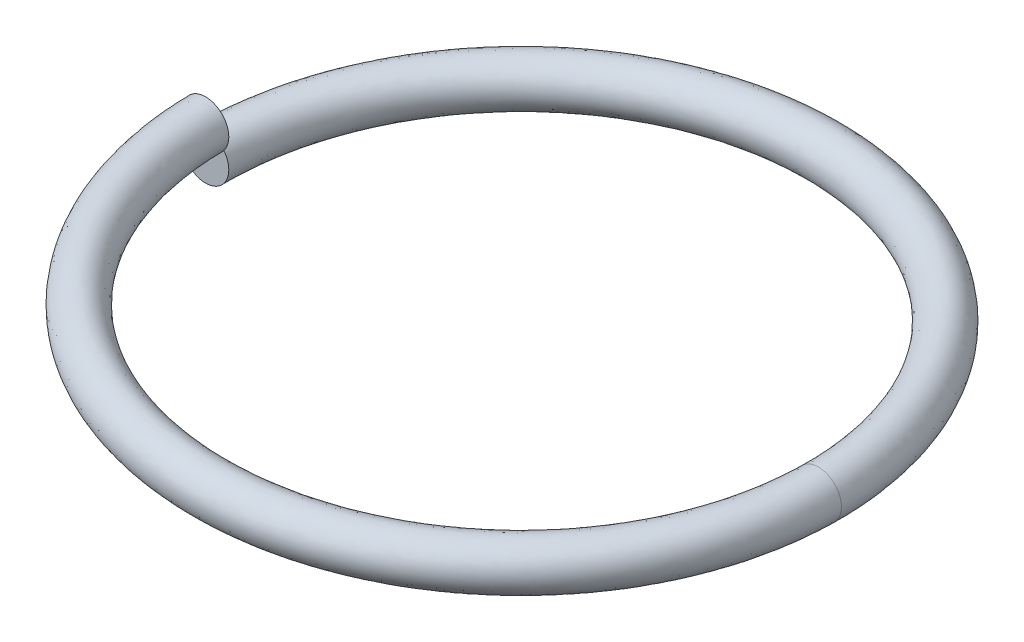
ISO-10303-21;
HEADER;
FILE_DESCRIPTION(('STEP AP214'),'2;1');
FILE_NAME('part.step','',(''),(''),'','','');
FILE_SCHEMA(('AUTOMOTIVE_DESIGN { 1 0 10303 214 1 1 1 1 }'));
ENDSEC;
DATA;
#1=APPLICATION_CONTEXT('core data for automotive mechanical design processes');
#2=APPLICATION_PROTOCOL_DEFINITION('international standard','automotive_design',2000,#1);
#3=PRODUCT_CONTEXT('',#1,'mechanical');
#4=PRODUCT('Part','Part','',(#3));
#5=PRODUCT_RELATED_PRODUCT_CATEGORY('part','',(#4));
#6=PRODUCT_DEFINITION_FORMATION('','',#4);
#7=PRODUCT_DEFINITION_CONTEXT('part definition',#1,'design');
#8=PRODUCT_DEFINITION('design','',#6,#7);
#9=PRODUCT_DEFINITION_SHAPE('','',#8);
#10=(LENGTH_UNIT() NAMED_UNIT(*) SI_UNIT(.MILLI.,.METRE.));
#11=(NAMED_UNIT(*) PLANE_ANGLE_UNIT() SI_UNIT($,.RADIAN.));
#12=(NAMED_UNIT(*) SI_UNIT($,.STERADIAN.) SOLID_ANGLE_UNIT());
#13=UNCERTAINTY_MEASURE_WITH_UNIT(LENGTH_MEASURE(1.E-05),#10,'distance_accuracy_value','');
#14=(GEOMETRIC_REPRESENTATION_CONTEXT(3) GLOBAL_UNCERTAINTY_ASSIGNED_CONTEXT((#13)) GLOBAL_UNIT_ASSIGNED_CONTEXT((#10,
#11,#12)) REPRESENTATION_CONTEXT('',''));
#15=CARTESIAN_POINT('',(0.,0.,0.));
#16=DIRECTION('',(0.,0.,1.));
#17=DIRECTION('',(1.,0.,0.));
#18=AXIS2_PLACEMENT_3D('',#15,#16,#17);
#19=CARTESIAN_POINT('',(7.95,0.4,0.));
#20=CARTESIAN_POINT('',(7.95000000000001,0.416666666666639,1.04065256451533));
#21=CARTESIAN_POINT('',(7.74308277875318,0.433333333333327,2.08089568249132));
#22=CARTESIAN_POINT('',(6.94660178817624,0.466666666666673,4.0037708921137));
#23=CARTESIAN_POINT('',(6.3573513956609,0.483333333333294,4.88564642520467));
#24=CARTESIAN_POINT('',(4.88564642520511,0.516666666666706,6.35735139566153));
#25=CARTESIAN_POINT('',(4.00377089210932,0.533333333333294,6.94660178817789));
#26=CARTESIAN_POINT('',(2.08089568249546,0.566666666666706,7.74308277875163));
#27=CARTESIAN_POINT('',(1.04065256451522,0.58333333333336,7.95));
#28=CARTESIAN_POINT('',(-1.04065256451539,0.61666666666664,7.95));
#29=CARTESIAN_POINT('',(-2.08089568249508,0.63333333333336,7.74308277875104));
#30=CARTESIAN_POINT('',(-4.00377089211001,0.66666666666664,6.94660178817835));
#31=CARTESIAN_POINT('',(-4.88564642520575,0.68333333333336,6.35735139566088));
#32=CARTESIAN_POINT('',(-6.35735139566049,0.71666666666664,4.88564642520509));
#33=CARTESIAN_POINT('',(-6.9466017881779,0.733333333333294,4.0037708921093));
#34=CARTESIAN_POINT('',(-7.74308277875165,0.766666666666706,2.08089568249543));
#35=CARTESIAN_POINT('',(-7.95,0.783333333333228,1.04065257047754));
#36=CARTESIAN_POINT('',(-7.95,0.8,-1.11029106575212E-13));
#37=CARTESIAN_POINT('',(7.95,1.7,0.));
#38=CARTESIAN_POINT('',(7.95000000000001,1.71666666666667,1.04065256451532));
#39=CARTESIAN_POINT('',(7.74308277875318,1.73333333333329,2.08089568249131));
#40=CARTESIAN_POINT('',(6.94660178817624,1.7666666666667,4.0037708921137));
#41=CARTESIAN_POINT('',(6.3573513956609,1.78333333333329,4.88564642520467));
#42=CARTESIAN_POINT('',(4.88564642520511,1.8166666666667,6.35735139566153));
#43=CARTESIAN_POINT('',(4.00377089210932,1.83333333333329,6.94660178817789));
#44=CARTESIAN_POINT('',(2.08089568249546,1.8666666666667,7.74308277875163));
#45=CARTESIAN_POINT('',(1.04065256451522,1.88333333333332,7.95));
#46=CARTESIAN_POINT('',(-1.04065256451539,1.91666666666667,7.95));
#47=CARTESIAN_POINT('',(-2.08089568249508,1.93333333333339,7.74308277875104));
#48=CARTESIAN_POINT('',(-4.00377089211001,1.9666666666666,6.94660178817835));
#49=CARTESIAN_POINT('',(-4.88564642520575,1.98333333333332,6.35735139566088));
#50=CARTESIAN_POINT('',(-6.35735139566049,2.01666666666667,4.88564642520509));
#51=CARTESIAN_POINT('',(-6.9466017881779,2.03333333333329,4.0037708921093));
#52=CARTESIAN_POINT('',(-7.74308277875165,2.0666666666667,2.08089568249543));
#53=CARTESIAN_POINT('',(-7.95,2.08333333333339,1.04065257047754));
#54=CARTESIAN_POINT('',(-7.95,2.1,-1.11029106575212E-13));
#55=CARTESIAN_POINT('',(9.25,1.7,0.));
#56=CARTESIAN_POINT('',(9.25000000000001,1.71666666666667,1.21082216625997));
#57=CARTESIAN_POINT('',(9.00924725829716,1.73333333333329,2.42116793245872));
#58=CARTESIAN_POINT('',(8.08252409316161,1.7666666666667,4.65847556629554));
#59=CARTESIAN_POINT('',(7.39691829054858,1.78333333333329,5.68455716140149));
#60=CARTESIAN_POINT('',(5.68455716140243,1.8166666666667,7.39691829054976));
#61=CARTESIAN_POINT('',(4.65847556629087,1.83333333333329,8.08252409316273));
#62=CARTESIAN_POINT('',(2.42116793246311,1.8666666666667,9.00924725829615));
#63=CARTESIAN_POINT('',(1.21082216625985,1.88333333333332,9.25));
#64=CARTESIAN_POINT('',(-1.21082216626004,1.91666666666667,9.25));
#65=CARTESIAN_POINT('',(-2.42116793246303,1.93333333333339,9.00924725829501));
#66=CARTESIAN_POINT('',(-4.65847556629132,1.9666666666666,8.08252409316372));
#67=CARTESIAN_POINT('',(-5.68455716140257,1.98333333333332,7.39691829054856));
#68=CARTESIAN_POINT('',(-7.39691829054872,2.01666666666667,5.68455716140241));
#69=CARTESIAN_POINT('',(-8.08252409316274,2.03333333333329,4.65847556629058));
#70=CARTESIAN_POINT('',(-9.00924725829616,2.0666666666667,2.42116793246335));
#71=CARTESIAN_POINT('',(-9.25000000000106,2.08333333333339,1.21082217319713));
#72=CARTESIAN_POINT('',(-9.25,2.1,-1.29184809537196E-13));
#73=CARTESIAN_POINT('',(9.25,0.4,0.));
#74=CARTESIAN_POINT('',(9.25000000000001,0.416666666666639,1.21082216625997));
#75=CARTESIAN_POINT('',(9.00924725829716,0.433333333333327,2.42116793245872));
#76=CARTESIAN_POINT('',(8.08252409316161,0.466666666666673,4.65847556629554));
#77=CARTESIAN_POINT('',(7.39691829054858,0.483333333333294,5.68455716140149));
#78=CARTESIAN_POINT('',(5.68455716140243,0.516666666666706,7.39691829054976));
#79=CARTESIAN_POINT('',(4.65847556629087,0.533333333333294,8.08252409316273));
#80=CARTESIAN_POINT('',(2.42116793246311,0.566666666666706,9.00924725829615));
#81=CARTESIAN_POINT('',(1.21082216625985,0.58333333333336,9.25));
#82=CARTESIAN_POINT('',(-1.21082216626004,0.61666666666664,9.25));
#83=CARTESIAN_POINT('',(-2.42116793246303,0.63333333333336,9.00924725829501));
#84=CARTESIAN_POINT('',(-4.65847556629132,0.66666666666664,8.08252409316372));
#85=CARTESIAN_POINT('',(-5.68455716140257,0.68333333333336,7.39691829054856));
#86=CARTESIAN_POINT('',(-7.39691829054872,0.71666666666664,5.68455716140241));
#87=CARTESIAN_POINT('',(-8.08252409316274,0.733333333333294,4.65847556629058));
#88=CARTESIAN_POINT('',(-9.00924725829616,0.766666666666706,2.42116793246335));
#89=CARTESIAN_POINT('',(-9.25000000000106,0.783333333333228,1.21082217319713));
#90=CARTESIAN_POINT('',(-9.25,0.8,-1.29184809537196E-13));
#91=CARTESIAN_POINT('',(9.25,-0.899999999999998,0.));
#92=CARTESIAN_POINT('',(9.25000000000001,-0.883333333333392,1.21082216625997));
#93=CARTESIAN_POINT('',(9.00924725829716,-0.866666666666638,2.42116793245872));
#94=CARTESIAN_POINT('',(8.08252409316161,-0.833333333333358,4.65847556629554));
#95=CARTESIAN_POINT('',(7.39691829054858,-0.816666666666704,5.68455716140149));
#96=CARTESIAN_POINT('',(5.68455716140243,-0.783333333333292,7.39691829054976));
#97=CARTESIAN_POINT('',(4.65847556629087,-0.766666666666704,8.08252409316273));
#98=CARTESIAN_POINT('',(2.42116793246311,-0.733333333333292,9.00924725829615));
#99=CARTESIAN_POINT('',(1.21082216625985,-0.716666666666604,9.25));
#100=CARTESIAN_POINT('',(-1.21082216626004,-0.683333333333391,9.25));
#101=CARTESIAN_POINT('',(-2.42116793246303,-0.666666666666671,9.00924725829501));
#102=CARTESIAN_POINT('',(-4.65847556629132,-0.633333333333325,8.08252409316372));
#103=CARTESIAN_POINT('',(-5.68455716140257,-0.616666666666605,7.39691829054856));
#104=CARTESIAN_POINT('',(-7.39691829054872,-0.583333333333391,5.68455716140241));
#105=CARTESIAN_POINT('',(-8.08252409316274,-0.566666666666704,4.65847556629058));
#106=CARTESIAN_POINT('',(-9.00924725829616,-0.533333333333292,2.42116793246335));
#107=CARTESIAN_POINT('',(-9.25000000000106,-0.516666666666936,1.21082217319713));
#108=CARTESIAN_POINT('',(-9.25,-0.499999999999998,-1.29184809537196E-13));
#109=CARTESIAN_POINT('',(7.95,-0.899999999999998,0.));
#110=CARTESIAN_POINT('',(7.95000000000001,-0.883333333333392,1.04065256451532));
#111=CARTESIAN_POINT('',(7.74308277875318,-0.866666666666638,2.08089568249131));
#112=CARTESIAN_POINT('',(6.94660178817624,-0.833333333333358,4.0037708921137));
#113=CARTESIAN_POINT('',(6.3573513956609,-0.816666666666704,4.88564642520467));
#114=CARTESIAN_POINT('',(4.88564642520511,-0.783333333333292,6.35735139566153));
#115=CARTESIAN_POINT('',(4.00377089210932,-0.766666666666704,6.94660178817789));
#116=CARTESIAN_POINT('',(2.08089568249546,-0.733333333333292,7.74308277875163));
#117=CARTESIAN_POINT('',(1.04065256451522,-0.716666666666604,7.95));
#118=CARTESIAN_POINT('',(-1.04065256451538,-0.683333333333391,7.95));
#119=CARTESIAN_POINT('',(-2.08089568249508,-0.666666666666671,7.74308277875104));
#120=CARTESIAN_POINT('',(-4.00377089211001,-0.633333333333325,6.94660178817835));
#121=CARTESIAN_POINT('',(-4.88564642520575,-0.616666666666605,6.35735139566088));
#122=CARTESIAN_POINT('',(-6.35735139566049,-0.583333333333391,4.88564642520509));
#123=CARTESIAN_POINT('',(-6.9466017881779,-0.566666666666704,4.0037708921093));
#124=CARTESIAN_POINT('',(-7.74308277875165,-0.533333333333292,2.08089568249543));
#125=CARTESIAN_POINT('',(-7.95,-0.516666666666936,1.04065257047754));
#126=CARTESIAN_POINT('',(-7.95,-0.499999999999998,-1.11029106575212E-13));
#127=CARTESIAN_POINT('',(7.95,0.4,0.));
#128=CARTESIAN_POINT('',(7.95000000000001,0.416666666666639,1.04065256451533));
#129=CARTESIAN_POINT('',(7.74308277875318,0.433333333333327,2.08089568249132));
#130=CARTESIAN_POINT('',(6.94660178817624,0.466666666666673,4.0037708921137));
#131=CARTESIAN_POINT('',(6.3573513956609,0.483333333333294,4.88564642520467));
#132=CARTESIAN_POINT('',(4.88564642520511,0.516666666666706,6.35735139566153));
#133=CARTESIAN_POINT('',(4.00377089210932,0.533333333333294,6.94660178817789));
#134=CARTESIAN_POINT('',(2.08089568249546,0.566666666666706,7.74308277875163));
#135=CARTESIAN_POINT('',(1.04065256451522,0.58333333333336,7.95));
#136=CARTESIAN_POINT('',(-1.04065256451539,0.61666666666664,7.95));
#137=CARTESIAN_POINT('',(-2.08089568249508,0.63333333333336,7.74308277875104));
#138=CARTESIAN_POINT('',(-4.00377089211001,0.66666666666664,6.94660178817835));
#139=CARTESIAN_POINT('',(-4.88564642520575,0.68333333333336,6.35735139566088));
#140=CARTESIAN_POINT('',(-6.35735139566049,0.71666666666664,4.88564642520509));
#141=CARTESIAN_POINT('',(-6.9466017881779,0.733333333333294,4.0037708921093));
#142=CARTESIAN_POINT('',(-7.74308277875165,0.766666666666706,2.08089568249543));
#143=CARTESIAN_POINT('',(-7.95,0.783333333333228,1.04065257047754));
#144=CARTESIAN_POINT('',(-7.95,0.8,-1.11029106575212E-13));
#145=(BOUNDED_SURFACE() B_SPLINE_SURFACE(3,3,((#19,#20,#21,#22,#23,#24,#25,#26,#27,#28,#29,#30,
#31,#32,#33,#34,#35,#36),(#37,#38,#39,#40,#41,#42,#43,#44,#45,#46,#47,#48,#49,#50,#51,#52,#53,
#54),(#55,#56,#57,#58,#59,#60,#61,#62,#63,#64,#65,#66,#67,#68,#69,#70,#71,#72),(#73,#74,#75,#76,
#77,#78,#79,#80,#81,#82,#83,#84,#85,#86,#87,#88,#89,#90),(#91,#92,#93,#94,#95,#96,#97,#98,#99,
#100,#101,#102,#103,#104,#105,#106,#107,#108),(#109,#110,#111,#112,#113,#114,#115,#116,#117,
#118,#119,#120,#121,#122,#123,#124,#125,#126),(#127,#128,#129,#130,#131,#132,#133,#134,#135,
#136,#137,#138,#139,#140,#141,#142,#143,#144)),.UNSPECIFIED.,.T.,.F.,
.F.) B_SPLINE_SURFACE_WITH_KNOTS((4,3,4),(4,2,2,2,2,2,2,2,4),(0.,0.5,1.),(0.5,0.5625,0.625,
0.6875,0.75,0.8125,0.875,0.9375,1.),
.UNSPECIFIED.) GEOMETRIC_REPRESENTATION_ITEM() RATIONAL_B_SPLINE_SURFACE(((1.,1.,1.,1.,1.,1.,1.,
1.,1.,1.,1.,1.,1.,1.,1.,1.,1.,1.),(0.333333333333333,0.333333333333333,0.333333333333333,
0.333333333333333,0.333333333333333,0.333333333333333,0.333333333333333,0.333333333333333,
0.333333333333333,0.333333333333333,0.333333333333333,0.333333333333333,0.333333333333333,
0.333333333333333,0.333333333333333,0.333333333333333,0.333333333333333,0.333333333333333),
(0.333333333333333,0.333333333333333,0.333333333333333,0.333333333333333,0.333333333333333,
0.333333333333333,0.333333333333333,0.333333333333333,0.333333333333333,0.333333333333333,
0.333333333333333,0.333333333333333,0.333333333333333,0.333333333333333,0.333333333333333,
0.333333333333333,0.333333333333333,0.333333333333333),(1.,1.,1.,1.,1.,1.,1.,1.,1.,1.,1.,1.,1.,
1.,1.,1.,1.,1.),(0.333333333333333,0.333333333333333,0.333333333333333,0.333333333333333,
0.333333333333333,0.333333333333333,0.333333333333333,0.333333333333333,0.333333333333333,
0.333333333333333,0.333333333333333,0.333333333333333,0.333333333333333,0.333333333333333,
0.333333333333333,0.333333333333333,0.333333333333333,0.333333333333333),(0.333333333333333,
0.333333333333333,0.333333333333333,0.333333333333333,0.333333333333333,0.333333333333333,
0.333333333333333,0.333333333333333,0.333333333333333,0.333333333333333,0.333333333333333,
0.333333333333333,0.333333333333333,0.333333333333333,0.333333333333333,0.333333333333333,
0.333333333333333,0.333333333333333),(1.,1.,1.,1.,1.,1.,1.,1.,1.,1.,1.,1.,1.,1.,1.,1.,1.,1.))) REPRESENTATION_ITEM('') SURFACE());
#146=CARTESIAN_POINT('',(-8.6,0.8,-1.20106958056204E-13));
#147=DIRECTION('',(0.,0.,1.));
#148=DIRECTION('',(1.,0.,0.));
#149=AXIS2_PLACEMENT_3D('',#146,#147,#148);
#150=CIRCLE('',#149,0.649999999999999);
#151=CARTESIAN_POINT('',(-7.95,0.8,-1.11029106575212E-13));
#152=VERTEX_POINT('',#151);
#153=EDGE_CURVE('E48',#152,#152,#150,.T.);
#154=CARTESIAN_POINT('',(8.6,0.399999999999998,0.));
#155=DIRECTION('',(0.,0.,-1.));
#156=DIRECTION('',(-1.,0.,0.));
#157=AXIS2_PLACEMENT_3D('',#154,#155,#156);
#158=CIRCLE('',#157,0.65);
#159=CARTESIAN_POINT('',(7.95,0.399999999999998,0.));
#160=VERTEX_POINT('',#159);
#161=EDGE_CURVE('E11',#160,#160,#158,.T.);
#162=ORIENTED_EDGE('',*,*,#153,.T.);
#163=EDGE_LOOP('',(#162));
#164=FACE_BOUND('',#163,.T.);
#165=ORIENTED_EDGE('',*,*,#161,.F.);
#166=EDGE_LOOP('',(#165));
#167=FACE_BOUND('',#166,.T.);
#168=ADVANCED_FACE('F39',(#164,#167),#145,.F.);
#169=CARTESIAN_POINT('',(-8.6,0.,0.));
#170=DIRECTION('',(0.,0.,1.));
#171=DIRECTION('',(1.,0.,0.));
#172=AXIS2_PLACEMENT_3D('',#169,#170,#171);
#173=PLANE('',#172);
#174=CARTESIAN_POINT('',(-8.6,0.,0.));
#175=DIRECTION('',(0.,0.,1.));
#176=DIRECTION('',(1.,0.,0.));
#177=AXIS2_PLACEMENT_3D('',#174,#175,#176);
#178=CIRCLE('',#177,0.649999999999999);
#179=CARTESIAN_POINT('',(-7.95,0.,0.));
#180=VERTEX_POINT('',#179);
#181=EDGE_CURVE('E53',#180,#180,#178,.T.);
#182=ORIENTED_EDGE('',*,*,#181,.T.);
#183=EDGE_LOOP('',(#182));
#184=FACE_BOUND('',#183,.T.);
#185=ADVANCED_FACE('F61',(#184),#173,.T.);
#186=CARTESIAN_POINT('',(-8.6,0.8,-1.20106958056204E-13));
#187=DIRECTION('',(0.,0.,1.));
#188=DIRECTION('',(1.,0.,0.));
#189=AXIS2_PLACEMENT_3D('',#186,#187,#188);
#190=PLANE('',#189);
#191=ORIENTED_EDGE('',*,*,#153,.F.);
#192=EDGE_LOOP('',(#191));
#193=FACE_BOUND('',#192,.T.);
#194=ADVANCED_FACE('F63',(#193),#190,.F.);
#195=CARTESIAN_POINT('',(-7.95,0.,0.));
#196=CARTESIAN_POINT('',(-7.95,0.0166666666666667,-1.04065257047652));
#197=CARTESIAN_POINT('',(-7.74308277875246,0.03333333333333,-2.08089568249237));
#198=CARTESIAN_POINT('',(-6.946601788177,0.06666666666667,-4.00377089211257));
#199=CARTESIAN_POINT('',(-6.35735139566025,0.0833333333333315,-4.88564642520639));
#200=CARTESIAN_POINT('',(-4.88564642520584,0.116666666666668,-6.35735139565974));
#201=CARTESIAN_POINT('',(-4.00377089211307,0.133333333333333,-6.94660178817669));
#202=CARTESIAN_POINT('',(-2.08089568249182,0.166666666666667,-7.74308277875279));
#203=CARTESIAN_POINT('',(-1.04065256451396,0.18333333333333,-7.95));
#204=CARTESIAN_POINT('',(1.04065256451402,0.21666666666667,-7.95));
#205=CARTESIAN_POINT('',(2.08089568249344,0.23333333333336,-7.74308277875212));
#206=CARTESIAN_POINT('',(4.00377089211155,0.26666666666664,-6.94660178817731));
#207=CARTESIAN_POINT('',(4.88564642520519,0.283333333333327,-6.35735139566092));
#208=CARTESIAN_POINT('',(6.35735139566098,0.316666666666673,-4.88564642520512));
#209=CARTESIAN_POINT('',(6.94660178817628,0.333333333333327,-4.00377089211386));
#210=CARTESIAN_POINT('',(7.7430827787532,0.366666666666672,-2.08089568249101));
#211=CARTESIAN_POINT('',(7.94999999999999,0.38333333333336,-1.04065256451528));
#212=CARTESIAN_POINT('',(7.95,0.4,0.));
#213=CARTESIAN_POINT('',(-7.95,1.3,0.));
#214=CARTESIAN_POINT('',(-7.95,1.31666666666666,-1.04065257047652));
#215=CARTESIAN_POINT('',(-7.74308277875246,1.33333333333333,-2.08089568249237));
#216=CARTESIAN_POINT('',(-6.946601788177,1.36666666666667,-4.00377089211257));
#217=CARTESIAN_POINT('',(-6.35735139566025,1.38333333333333,-4.88564642520639));
#218=CARTESIAN_POINT('',(-4.88564642520584,1.41666666666667,-6.35735139565974));
#219=CARTESIAN_POINT('',(-4.00377089211307,1.43333333333333,-6.94660178817669));
#220=CARTESIAN_POINT('',(-2.08089568249182,1.46666666666666,-7.74308277875279));
#221=CARTESIAN_POINT('',(-1.04065256451396,1.48333333333333,-7.95));
#222=CARTESIAN_POINT('',(1.04065256451402,1.51666666666667,-7.95));
#223=CARTESIAN_POINT('',(2.08089568249344,1.53333333333349,-7.74308277875212));
#224=CARTESIAN_POINT('',(4.00377089211155,1.56666666666651,-6.94660178817731));
#225=CARTESIAN_POINT('',(4.88564642520519,1.58333333333332,-6.35735139566092));
#226=CARTESIAN_POINT('',(6.35735139566098,1.61666666666667,-4.88564642520512));
#227=CARTESIAN_POINT('',(6.94660178817628,1.63333333333332,-4.00377089211386));
#228=CARTESIAN_POINT('',(7.7430827787532,1.66666666666667,-2.08089568249101));
#229=CARTESIAN_POINT('',(7.94999999999999,1.68333333333332,-1.04065256451528));
#230=CARTESIAN_POINT('',(7.95,1.7,0.));
#231=CARTESIAN_POINT('',(-9.25,1.3,0.));
#232=CARTESIAN_POINT('',(-9.25000000000106,1.31666666666666,-1.21082217319595));
#233=CARTESIAN_POINT('',(-9.00924725829755,1.33333333333333,-2.42116793245991));
#234=CARTESIAN_POINT('',(-8.08252409316125,1.36666666666667,-4.65847556629427));
#235=CARTESIAN_POINT('',(-7.39691829054755,1.38333333333333,-5.68455716140358));
#236=CARTESIAN_POINT('',(-5.68455716140356,1.41666666666667,-7.39691829054757));
#237=CARTESIAN_POINT('',(-4.65847556629515,1.43333333333333,-8.08252409316089));
#238=CARTESIAN_POINT('',(-2.42116793245897,1.46666666666666,-9.00924725829794));
#239=CARTESIAN_POINT('',(-1.21082216625838,1.48333333333333,-9.25));
#240=CARTESIAN_POINT('',(1.21082216625845,1.51666666666667,-9.25));
#241=CARTESIAN_POINT('',(2.42116793246138,1.53333333333349,-9.0092472582961));
#242=CARTESIAN_POINT('',(4.65847556629285,1.56666666666651,-8.08252409316268));
#243=CARTESIAN_POINT('',(5.68455716140252,1.58333333333332,-7.39691829054913));
#244=CARTESIAN_POINT('',(7.39691829054867,1.61666666666667,-5.68455716140193));
#245=CARTESIAN_POINT('',(8.08252409316165,1.63333333333332,-4.65847556629568));
#246=CARTESIAN_POINT('',(9.00924725829718,1.66666666666667,-2.42116793245841));
#247=CARTESIAN_POINT('',(9.24999999999999,1.68333333333332,-1.21082216625992));
#248=CARTESIAN_POINT('',(9.25,1.7,0.));
#249=CARTESIAN_POINT('',(-9.25,0.,0.));
#250=CARTESIAN_POINT('',(-9.25000000000106,0.0166666666666667,-1.21082217319595));
#251=CARTESIAN_POINT('',(-9.00924725829755,0.0333333333333301,-2.42116793245991));
#252=CARTESIAN_POINT('',(-8.08252409316125,0.0666666666666701,-4.65847556629427));
#253=CARTESIAN_POINT('',(-7.39691829054755,0.0833333333333316,-5.68455716140358));
#254=CARTESIAN_POINT('',(-5.68455716140356,0.116666666666669,-7.39691829054757));
#255=CARTESIAN_POINT('',(-4.65847556629515,0.133333333333333,-8.08252409316089));
#256=CARTESIAN_POINT('',(-2.42116793245897,0.166666666666667,-9.00924725829794));
#257=CARTESIAN_POINT('',(-1.21082216625838,0.18333333333333,-9.25));
#258=CARTESIAN_POINT('',(1.21082216625845,0.21666666666667,-9.25));
#259=CARTESIAN_POINT('',(2.42116793246138,0.23333333333336,-9.0092472582961));
#260=CARTESIAN_POINT('',(4.65847556629285,0.26666666666664,-8.08252409316268));
#261=CARTESIAN_POINT('',(5.68455716140252,0.283333333333327,-7.39691829054913));
#262=CARTESIAN_POINT('',(7.39691829054867,0.316666666666673,-5.68455716140193));
#263=CARTESIAN_POINT('',(8.08252409316165,0.333333333333327,-4.65847556629568));
#264=CARTESIAN_POINT('',(9.00924725829718,0.366666666666673,-2.42116793245841));
#265=CARTESIAN_POINT('',(9.24999999999999,0.38333333333336,-1.21082216625992));
#266=CARTESIAN_POINT('',(9.25,0.4,0.));
#267=CARTESIAN_POINT('',(-9.25,-1.3,0.));
#268=CARTESIAN_POINT('',(-9.25000000000106,-1.28333333333333,-1.21082217319595));
#269=CARTESIAN_POINT('',(-9.00924725829755,-1.26666666666667,-2.42116793245991));
#270=CARTESIAN_POINT('',(-8.08252409316125,-1.23333333333333,-4.65847556629427));
#271=CARTESIAN_POINT('',(-7.39691829054755,-1.21666666666667,-5.68455716140358));
#272=CARTESIAN_POINT('',(-5.68455716140356,-1.18333333333333,-7.39691829054757));
#273=CARTESIAN_POINT('',(-4.65847556629515,-1.16666666666666,-8.08252409316089));
#274=CARTESIAN_POINT('',(-2.42116793245897,-1.13333333333333,-9.00924725829794));
#275=CARTESIAN_POINT('',(-1.21082216625838,-1.11666666666667,-9.25));
#276=CARTESIAN_POINT('',(1.21082216625845,-1.08333333333333,-9.25));
#277=CARTESIAN_POINT('',(2.42116793246138,-1.06666666666677,-9.0092472582961));
#278=CARTESIAN_POINT('',(4.65847556629285,-1.03333333333323,-8.08252409316268));
#279=CARTESIAN_POINT('',(5.68455716140252,-1.01666666666667,-7.39691829054913));
#280=CARTESIAN_POINT('',(7.39691829054867,-0.983333333333325,-5.68455716140193));
#281=CARTESIAN_POINT('',(8.08252409316165,-0.966666666666671,-4.65847556629568));
#282=CARTESIAN_POINT('',(9.00924725829718,-0.933333333333325,-2.42116793245841));
#283=CARTESIAN_POINT('',(9.24999999999999,-0.916666666666605,-1.21082216625992));
#284=CARTESIAN_POINT('',(9.25,-0.899999999999998,0.));
#285=CARTESIAN_POINT('',(-7.95,-1.3,0.));
#286=CARTESIAN_POINT('',(-7.95,-1.28333333333333,-1.04065257047652));
#287=CARTESIAN_POINT('',(-7.74308277875246,-1.26666666666667,-2.08089568249237));
#288=CARTESIAN_POINT('',(-6.946601788177,-1.23333333333333,-4.00377089211257));
#289=CARTESIAN_POINT('',(-6.35735139566025,-1.21666666666667,-4.88564642520639));
#290=CARTESIAN_POINT('',(-4.88564642520584,-1.18333333333333,-6.35735139565974));
#291=CARTESIAN_POINT('',(-4.00377089211307,-1.16666666666666,-6.94660178817669));
#292=CARTESIAN_POINT('',(-2.08089568249182,-1.13333333333333,-7.74308277875279));
#293=CARTESIAN_POINT('',(-1.04065256451396,-1.11666666666667,-7.95));
#294=CARTESIAN_POINT('',(1.04065256451402,-1.08333333333333,-7.95));
#295=CARTESIAN_POINT('',(2.08089568249344,-1.06666666666677,-7.74308277875212));
#296=CARTESIAN_POINT('',(4.00377089211155,-1.03333333333323,-6.94660178817731));
#297=CARTESIAN_POINT('',(4.88564642520519,-1.01666666666667,-6.35735139566092));
#298=CARTESIAN_POINT('',(6.35735139566098,-0.983333333333325,-4.88564642520512));
#299=CARTESIAN_POINT('',(6.94660178817628,-0.966666666666671,-4.00377089211386));
#300=CARTESIAN_POINT('',(7.7430827787532,-0.933333333333325,-2.08089568249101));
#301=CARTESIAN_POINT('',(7.94999999999999,-0.916666666666605,-1.04065256451528));
#302=CARTESIAN_POINT('',(7.95,-0.899999999999998,0.));
#303=CARTESIAN_POINT('',(-7.95,0.,0.));
#304=CARTESIAN_POINT('',(-7.95,0.0166666666666667,-1.04065257047652));
#305=CARTESIAN_POINT('',(-7.74308277875246,0.03333333333333,-2.08089568249237));
#306=CARTESIAN_POINT('',(-6.946601788177,0.06666666666667,-4.00377089211257));
#307=CARTESIAN_POINT('',(-6.35735139566025,0.0833333333333315,-4.88564642520639));
#308=CARTESIAN_POINT('',(-4.88564642520584,0.116666666666668,-6.35735139565974));
#309=CARTESIAN_POINT('',(-4.00377089211307,0.133333333333333,-6.94660178817669));
#310=CARTESIAN_POINT('',(-2.08089568249182,0.166666666666667,-7.74308277875279));
#311=CARTESIAN_POINT('',(-1.04065256451396,0.18333333333333,-7.95));
#312=CARTESIAN_POINT('',(1.04065256451402,0.21666666666667,-7.95));
#313=CARTESIAN_POINT('',(2.08089568249344,0.23333333333336,-7.74308277875212));
#314=CARTESIAN_POINT('',(4.00377089211155,0.26666666666664,-6.94660178817731));
#315=CARTESIAN_POINT('',(4.88564642520519,0.283333333333327,-6.35735139566092));
#316=CARTESIAN_POINT('',(6.35735139566098,0.316666666666673,-4.88564642520512));
#317=CARTESIAN_POINT('',(6.94660178817628,0.333333333333327,-4.00377089211386));
#318=CARTESIAN_POINT('',(7.7430827787532,0.366666666666672,-2.08089568249101));
#319=CARTESIAN_POINT('',(7.94999999999999,0.38333333333336,-1.04065256451528));
#320=CARTESIAN_POINT('',(7.95,0.4,0.));
#321=(BOUNDED_SURFACE() B_SPLINE_SURFACE(3,3,((#195,#196,#197,#198,#199,#200,#201,#202,#203,
#204,#205,#206,#207,#208,#209,#210,#211,#212),(#213,#214,#215,#216,#217,#218,#219,#220,#221,
#222,#223,#224,#225,#226,#227,#228,#229,#230),(#231,#232,#233,#234,#235,#236,#237,#238,#239,
#240,#241,#242,#243,#244,#245,#246,#247,#248),(#249,#250,#251,#252,#253,#254,#255,#256,#257,
#258,#259,#260,#261,#262,#263,#264,#265,#266),(#267,#268,#269,#270,#271,#272,#273,#274,#275,
#276,#277,#278,#279,#280,#281,#282,#283,#284),(#285,#286,#287,#288,#289,#290,#291,#292,#293,
#294,#295,#296,#297,#298,#299,#300,#301,#302),(#303,#304,#305,#306,#307,#308,#309,#310,#311,
#312,#313,#314,#315,#316,#317,#318,#319,#320)),.UNSPECIFIED.,.T.,.F.,
.F.) B_SPLINE_SURFACE_WITH_KNOTS((4,3,4),(4,2,2,2,2,2,2,2,4),(0.,0.5,1.),(0.,0.0625,0.125,
0.1875,0.25,0.3125,0.375,0.4375,0.5),
.UNSPECIFIED.) GEOMETRIC_REPRESENTATION_ITEM() RATIONAL_B_SPLINE_SURFACE(((1.,1.,1.,1.,1.,1.,1.,
1.,1.,1.,1.,1.,1.,1.,1.,1.,1.,1.),(0.333333333333333,0.333333333333333,0.333333333333333,
0.333333333333333,0.333333333333333,0.333333333333333,0.333333333333333,0.333333333333333,
0.333333333333333,0.333333333333333,0.333333333333333,0.333333333333333,0.333333333333333,
0.333333333333333,0.333333333333333,0.333333333333333,0.333333333333333,0.333333333333333),
(0.333333333333333,0.333333333333333,0.333333333333333,0.333333333333333,0.333333333333333,
0.333333333333333,0.333333333333333,0.333333333333333,0.333333333333333,0.333333333333333,
0.333333333333333,0.333333333333333,0.333333333333333,0.333333333333333,0.333333333333333,
0.333333333333333,0.333333333333333,0.333333333333333),(1.,1.,1.,1.,1.,1.,1.,1.,1.,1.,1.,1.,1.,
1.,1.,1.,1.,1.),(0.333333333333333,0.333333333333333,0.333333333333333,0.333333333333333,
0.333333333333333,0.333333333333333,0.333333333333333,0.333333333333333,0.333333333333333,
0.333333333333333,0.333333333333333,0.333333333333333,0.333333333333333,0.333333333333333,
0.333333333333333,0.333333333333333,0.333333333333333,0.333333333333333),(0.333333333333333,
0.333333333333333,0.333333333333333,0.333333333333333,0.333333333333333,0.333333333333333,
0.333333333333333,0.333333333333333,0.333333333333333,0.333333333333333,0.333333333333333,
0.333333333333333,0.333333333333333,0.333333333333333,0.333333333333333,0.333333333333333,
0.333333333333333,0.333333333333333),(1.,1.,1.,1.,1.,1.,1.,1.,1.,1.,1.,1.,1.,1.,1.,1.,1.,1.))) REPRESENTATION_ITEM('') SURFACE());
#322=ORIENTED_EDGE('',*,*,#161,.T.);
#323=EDGE_LOOP('',(#322));
#324=FACE_BOUND('',#323,.T.);
#325=ORIENTED_EDGE('',*,*,#181,.F.);
#326=EDGE_LOOP('',(#325));
#327=FACE_BOUND('',#326,.T.);
#328=ADVANCED_FACE('F69',(#324,#327),#321,.F.);
#329=CLOSED_SHELL('',(#168,#185,#194,#328));
#330=MANIFOLD_SOLID_BREP('B2',#329);
#331=ADVANCED_BREP_SHAPE_REPRESENTATION('',(#18,#330),#14);
#332=SHAPE_DEFINITION_REPRESENTATION(#9,#331);
ENDSEC;
END-ISO-10303-21;
